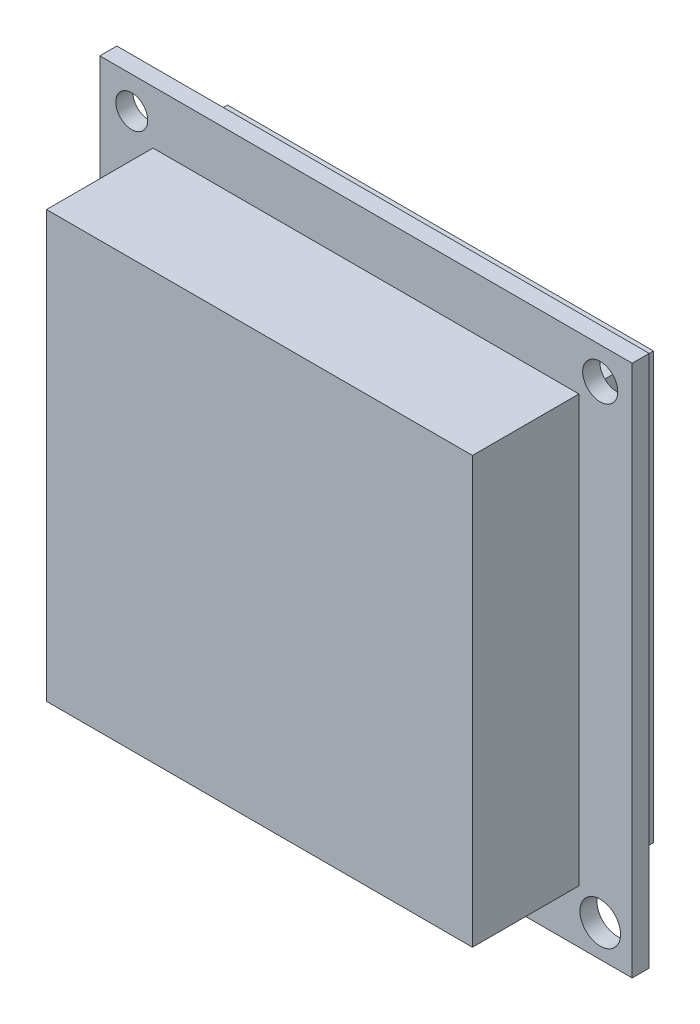
ISO-10303-21;
HEADER;
FILE_DESCRIPTION(('STEP AP214'),'2;1');
FILE_NAME('part.step','',(''),(''),'','','');
FILE_SCHEMA(('AUTOMOTIVE_DESIGN { 1 0 10303 214 1 1 1 1 }'));
ENDSEC;
DATA;
#1=APPLICATION_CONTEXT('core data for automotive mechanical design processes');
#2=APPLICATION_PROTOCOL_DEFINITION('international standard','automotive_design',2000,#1);
#3=PRODUCT_CONTEXT('',#1,'mechanical');
#4=PRODUCT('Part','Part','',(#3));
#5=PRODUCT_RELATED_PRODUCT_CATEGORY('part','',(#4));
#6=PRODUCT_DEFINITION_FORMATION('','',#4);
#7=PRODUCT_DEFINITION_CONTEXT('part definition',#1,'design');
#8=PRODUCT_DEFINITION('design','',#6,#7);
#9=PRODUCT_DEFINITION_SHAPE('','',#8);
#10=(LENGTH_UNIT() NAMED_UNIT(*) SI_UNIT(.MILLI.,.METRE.));
#11=(NAMED_UNIT(*) PLANE_ANGLE_UNIT() SI_UNIT($,.RADIAN.));
#12=(NAMED_UNIT(*) SI_UNIT($,.STERADIAN.) SOLID_ANGLE_UNIT());
#13=UNCERTAINTY_MEASURE_WITH_UNIT(LENGTH_MEASURE(1.E-05),#10,'distance_accuracy_value','');
#14=(GEOMETRIC_REPRESENTATION_CONTEXT(3) GLOBAL_UNCERTAINTY_ASSIGNED_CONTEXT((#13)) GLOBAL_UNIT_ASSIGNED_CONTEXT((#10,
#11,#12)) REPRESENTATION_CONTEXT('',''));
#15=CARTESIAN_POINT('',(0.,0.,0.));
#16=DIRECTION('',(0.,0.,1.));
#17=DIRECTION('',(1.,0.,0.));
#18=AXIS2_PLACEMENT_3D('',#15,#16,#17);
#19=CARTESIAN_POINT('',(0.,-55.1414213562373,0.8));
#20=DIRECTION('',(0.,0.,1.));
#21=DIRECTION('',(1.,0.,0.));
#22=AXIS2_PLACEMENT_3D('',#19,#20,#21);
#23=PLANE('',#22);
#24=CARTESIAN_POINT('',(-22.,-22.,0.8));
#25=DIRECTION('',(0.,0.,1.));
#26=DIRECTION('',(1.,0.,0.));
#27=AXIS2_PLACEMENT_3D('',#24,#25,#26);
#28=CIRCLE('',#27,1.75908055301192);
#29=CARTESIAN_POINT('',(-20.2409194469881,-22.,0.8));
#30=VERTEX_POINT('',#29);
#31=EDGE_CURVE('E197',#30,#30,#28,.T.);
#32=ORIENTED_EDGE('',*,*,#31,.F.);
#33=EDGE_LOOP('',(#32));
#34=FACE_BOUND('',#33,.T.);
#35=CARTESIAN_POINT('',(22.,22.,0.8));
#36=DIRECTION('',(0.,0.,1.));
#37=DIRECTION('',(1.,0.,0.));
#38=AXIS2_PLACEMENT_3D('',#35,#36,#37);
#39=CIRCLE('',#38,1.64693502393852);
#40=CARTESIAN_POINT('',(23.6469350239385,22.,0.8));
#41=VERTEX_POINT('',#40);
#42=EDGE_CURVE('E194',#41,#41,#39,.T.);
#43=ORIENTED_EDGE('',*,*,#42,.F.);
#44=EDGE_LOOP('',(#43));
#45=FACE_BOUND('',#44,.T.);
#46=CARTESIAN_POINT('',(22.,-22.,0.8));
#47=DIRECTION('',(0.,0.,1.));
#48=DIRECTION('',(1.,0.,0.));
#49=AXIS2_PLACEMENT_3D('',#46,#47,#48);
#50=CIRCLE('',#49,1.90819247149676);
#51=CARTESIAN_POINT('',(23.9081924714968,-22.,0.8));
#52=VERTEX_POINT('',#51);
#53=EDGE_CURVE('E191',#52,#52,#50,.T.);
#54=ORIENTED_EDGE('',*,*,#53,.F.);
#55=EDGE_LOOP('',(#54));
#56=FACE_BOUND('',#55,.T.);
#57=CARTESIAN_POINT('',(-22.,22.,0.8));
#58=DIRECTION('',(0.,0.,1.));
#59=DIRECTION('',(1.,0.,0.));
#60=AXIS2_PLACEMENT_3D('',#57,#58,#59);
#61=CIRCLE('',#60,1.5);
#62=CARTESIAN_POINT('',(-20.5,22.,0.8));
#63=VERTEX_POINT('',#62);
#64=EDGE_CURVE('E188',#63,#63,#61,.T.);
#65=ORIENTED_EDGE('',*,*,#64,.F.);
#66=EDGE_LOOP('',(#65));
#67=FACE_BOUND('',#66,.T.);
#68=DIRECTION('',(-1.,0.,0.));
#69=VECTOR('',#68,1.);
#70=CARTESIAN_POINT('',(0.,-25.,0.8));
#71=LINE('',#70,#69);
#72=CARTESIAN_POINT('',(25.,-25.,0.8));
#73=VERTEX_POINT('',#72);
#74=CARTESIAN_POINT('',(-25.,-25.,0.8));
#75=VERTEX_POINT('',#74);
#76=EDGE_CURVE('E175',#73,#75,#71,.T.);
#77=ORIENTED_EDGE('',*,*,#76,.F.);
#78=DIRECTION('',(0.,-1.,0.));
#79=VECTOR('',#78,1.);
#80=CARTESIAN_POINT('',(25.,-55.1414213562373,0.8));
#81=LINE('',#80,#79);
#82=CARTESIAN_POINT('',(25.,25.,0.8));
#83=VERTEX_POINT('',#82);
#84=EDGE_CURVE('E178',#83,#73,#81,.T.);
#85=ORIENTED_EDGE('',*,*,#84,.F.);
#86=DIRECTION('',(1.,0.,0.));
#87=VECTOR('',#86,1.);
#88=CARTESIAN_POINT('',(0.,25.,0.8));
#89=LINE('',#88,#87);
#90=CARTESIAN_POINT('',(-25.,25.,0.8));
#91=VERTEX_POINT('',#90);
#92=EDGE_CURVE('E182',#91,#83,#89,.T.);
#93=ORIENTED_EDGE('',*,*,#92,.F.);
#94=DIRECTION('',(0.,1.,0.));
#95=VECTOR('',#94,1.);
#96=CARTESIAN_POINT('',(-25.,-55.1414213562373,0.8));
#97=LINE('',#96,#95);
#98=EDGE_CURVE('E185',#75,#91,#97,.T.);
#99=ORIENTED_EDGE('',*,*,#98,.F.);
#100=EDGE_LOOP('',(#77,#85,#93,#99));
#101=FACE_BOUND('',#100,.T.);
#102=DIRECTION('',(0.,-1.,0.));
#103=VECTOR('',#102,1.);
#104=CARTESIAN_POINT('',(20.,-55.1414213562373,0.8));
#105=LINE('',#104,#103);
#106=CARTESIAN_POINT('',(20.,20.,0.8));
#107=VERTEX_POINT('',#106);
#108=CARTESIAN_POINT('',(20.,-20.,0.8));
#109=VERTEX_POINT('',#108);
#110=EDGE_CURVE('E156',#107,#109,#105,.T.);
#111=ORIENTED_EDGE('',*,*,#110,.T.);
#112=DIRECTION('',(-1.,0.,0.));
#113=VECTOR('',#112,1.);
#114=CARTESIAN_POINT('',(0.,-20.,0.8));
#115=LINE('',#114,#113);
#116=CARTESIAN_POINT('',(-20.,-20.,0.8));
#117=VERTEX_POINT('',#116);
#118=EDGE_CURVE('E123',#109,#117,#115,.T.);
#119=ORIENTED_EDGE('',*,*,#118,.T.);
#120=DIRECTION('',(0.,1.,0.));
#121=VECTOR('',#120,1.);
#122=CARTESIAN_POINT('',(-20.,-55.1414213562373,0.8));
#123=LINE('',#122,#121);
#124=CARTESIAN_POINT('',(-20.,20.,0.8));
#125=VERTEX_POINT('',#124);
#126=EDGE_CURVE('E170',#117,#125,#123,.T.);
#127=ORIENTED_EDGE('',*,*,#126,.T.);
#128=DIRECTION('',(1.,0.,0.));
#129=VECTOR('',#128,1.);
#130=CARTESIAN_POINT('',(0.,20.,0.8));
#131=LINE('',#130,#129);
#132=EDGE_CURVE('E167',#125,#107,#131,.T.);
#133=ORIENTED_EDGE('',*,*,#132,.T.);
#134=EDGE_LOOP('',(#111,#119,#127,#133));
#135=FACE_BOUND('',#134,.T.);
#136=ADVANCED_FACE('F31',(#34,#45,#56,#67,#101,#135),#23,.T.);
#137=CARTESIAN_POINT('',(0.,-55.1414213562373,-0.8));
#138=DIRECTION('',(0.,0.,1.));
#139=DIRECTION('',(1.,0.,0.));
#140=AXIS2_PLACEMENT_3D('',#137,#138,#139);
#141=PLANE('',#140);
#142=CARTESIAN_POINT('',(-22.,-22.,-0.8));
#143=DIRECTION('',(0.,0.,1.));
#144=DIRECTION('',(1.,0.,0.));
#145=AXIS2_PLACEMENT_3D('',#142,#143,#144);
#146=CIRCLE('',#145,1.75908055301192);
#147=CARTESIAN_POINT('',(-20.2409194469881,-22.,-0.8));
#148=VERTEX_POINT('',#147);
#149=EDGE_CURVE('E179',#148,#148,#146,.T.);
#150=ORIENTED_EDGE('',*,*,#149,.T.);
#151=EDGE_LOOP('',(#150));
#152=FACE_BOUND('',#151,.T.);
#153=CARTESIAN_POINT('',(22.,22.,-0.8));
#154=DIRECTION('',(0.,0.,1.));
#155=DIRECTION('',(1.,0.,0.));
#156=AXIS2_PLACEMENT_3D('',#153,#154,#155);
#157=CIRCLE('',#156,1.64693502393852);
#158=CARTESIAN_POINT('',(23.6469350239385,22.,-0.8));
#159=VERTEX_POINT('',#158);
#160=EDGE_CURVE('E218',#159,#159,#157,.T.);
#161=ORIENTED_EDGE('',*,*,#160,.T.);
#162=EDGE_LOOP('',(#161));
#163=FACE_BOUND('',#162,.T.);
#164=CARTESIAN_POINT('',(22.,-22.,-0.8));
#165=DIRECTION('',(0.,0.,1.));
#166=DIRECTION('',(1.,0.,0.));
#167=AXIS2_PLACEMENT_3D('',#164,#165,#166);
#168=CIRCLE('',#167,1.90819247149676);
#169=CARTESIAN_POINT('',(23.9081924714968,-22.,-0.8));
#170=VERTEX_POINT('',#169);
#171=EDGE_CURVE('E215',#170,#170,#168,.T.);
#172=ORIENTED_EDGE('',*,*,#171,.T.);
#173=EDGE_LOOP('',(#172));
#174=FACE_BOUND('',#173,.T.);
#175=CARTESIAN_POINT('',(-22.,22.,-0.8));
#176=DIRECTION('',(0.,0.,1.));
#177=DIRECTION('',(1.,0.,0.));
#178=AXIS2_PLACEMENT_3D('',#175,#176,#177);
#179=CIRCLE('',#178,1.5);
#180=CARTESIAN_POINT('',(-20.5,22.,-0.8));
#181=VERTEX_POINT('',#180);
#182=EDGE_CURVE('E212',#181,#181,#179,.T.);
#183=ORIENTED_EDGE('',*,*,#182,.T.);
#184=EDGE_LOOP('',(#183));
#185=FACE_BOUND('',#184,.T.);
#186=DIRECTION('',(-1.,0.,0.));
#187=VECTOR('',#186,1.);
#188=CARTESIAN_POINT('',(0.,-25.,-0.8));
#189=LINE('',#188,#187);
#190=CARTESIAN_POINT('',(25.,-25.,-0.8));
#191=VERTEX_POINT('',#190);
#192=CARTESIAN_POINT('',(-25.,-25.,-0.8));
#193=VERTEX_POINT('',#192);
#194=EDGE_CURVE('E174',#191,#193,#189,.T.);
#195=ORIENTED_EDGE('',*,*,#194,.T.);
#196=DIRECTION('',(0.,1.,0.));
#197=VECTOR('',#196,1.);
#198=CARTESIAN_POINT('',(-25.,-55.1414213562373,-0.8));
#199=LINE('',#198,#197);
#200=CARTESIAN_POINT('',(-25.,25.,-0.8));
#201=VERTEX_POINT('',#200);
#202=EDGE_CURVE('E209',#193,#201,#199,.T.);
#203=ORIENTED_EDGE('',*,*,#202,.T.);
#204=DIRECTION('',(1.,0.,0.));
#205=VECTOR('',#204,1.);
#206=CARTESIAN_POINT('',(0.,25.,-0.8));
#207=LINE('',#206,#205);
#208=CARTESIAN_POINT('',(25.,25.,-0.8));
#209=VERTEX_POINT('',#208);
#210=EDGE_CURVE('E206',#201,#209,#207,.T.);
#211=ORIENTED_EDGE('',*,*,#210,.T.);
#212=DIRECTION('',(0.,-1.,0.));
#213=VECTOR('',#212,1.);
#214=CARTESIAN_POINT('',(25.,-55.1414213562373,-0.8));
#215=LINE('',#214,#213);
#216=EDGE_CURVE('E203',#209,#191,#215,.T.);
#217=ORIENTED_EDGE('',*,*,#216,.T.);
#218=EDGE_LOOP('',(#195,#203,#211,#217));
#219=FACE_BOUND('',#218,.T.);
#220=DIRECTION('',(-1.,0.,0.));
#221=VECTOR('',#220,1.);
#222=CARTESIAN_POINT('',(0.,-20.,-0.8));
#223=LINE('',#222,#221);
#224=CARTESIAN_POINT('',(20.,-20.,-0.8));
#225=VERTEX_POINT('',#224);
#226=CARTESIAN_POINT('',(-20.,-20.,-0.8));
#227=VERTEX_POINT('',#226);
#228=EDGE_CURVE('E11',#225,#227,#223,.T.);
#229=ORIENTED_EDGE('',*,*,#228,.F.);
#230=DIRECTION('',(0.,-1.,0.));
#231=VECTOR('',#230,1.);
#232=CARTESIAN_POINT('',(20.,-55.1414213562373,-0.8));
#233=LINE('',#232,#231);
#234=CARTESIAN_POINT('',(20.,20.,-0.8));
#235=VERTEX_POINT('',#234);
#236=EDGE_CURVE('E230',#235,#225,#233,.T.);
#237=ORIENTED_EDGE('',*,*,#236,.F.);
#238=DIRECTION('',(1.,0.,0.));
#239=VECTOR('',#238,1.);
#240=CARTESIAN_POINT('',(0.,20.,-0.8));
#241=LINE('',#240,#239);
#242=CARTESIAN_POINT('',(-20.,20.,-0.8));
#243=VERTEX_POINT('',#242);
#244=EDGE_CURVE('E233',#243,#235,#241,.T.);
#245=ORIENTED_EDGE('',*,*,#244,.F.);
#246=DIRECTION('',(0.,1.,0.));
#247=VECTOR('',#246,1.);
#248=CARTESIAN_POINT('',(-20.,-55.1414213562373,-0.8));
#249=LINE('',#248,#247);
#250=EDGE_CURVE('E39',#227,#243,#249,.T.);
#251=ORIENTED_EDGE('',*,*,#250,.F.);
#252=EDGE_LOOP('',(#229,#237,#245,#251));
#253=FACE_BOUND('',#252,.T.);
#254=ADVANCED_FACE('F250',(#152,#163,#174,#185,#219,#253),#141,.F.);
#255=CARTESIAN_POINT('',(0.,-25.,0.8));
#256=DIRECTION('',(0.,-1.,0.));
#257=DIRECTION('',(1.,0.,0.));
#258=AXIS2_PLACEMENT_3D('',#255,#256,#257);
#259=PLANE('',#258);
#260=ORIENTED_EDGE('',*,*,#194,.F.);
#261=DIRECTION('',(0.,0.,-1.));
#262=VECTOR('',#261,1.);
#263=CARTESIAN_POINT('',(25.,-25.,0.8));
#264=LINE('',#263,#262);
#265=EDGE_CURVE('E228',#73,#191,#264,.T.);
#266=ORIENTED_EDGE('',*,*,#265,.F.);
#267=ORIENTED_EDGE('',*,*,#76,.T.);
#268=DIRECTION('',(0.,0.,-1.));
#269=VECTOR('',#268,1.);
#270=CARTESIAN_POINT('',(-25.,-25.,0.8));
#271=LINE('',#270,#269);
#272=EDGE_CURVE('E200',#75,#193,#271,.T.);
#273=ORIENTED_EDGE('',*,*,#272,.T.);
#274=EDGE_LOOP('',(#260,#266,#267,#273));
#275=FACE_BOUND('',#274,.T.);
#276=ADVANCED_FACE('F33',(#275),#259,.T.);
#277=CARTESIAN_POINT('',(25.,-55.1414213562373,0.8));
#278=DIRECTION('',(1.,0.,0.));
#279=DIRECTION('',(0.,1.,0.));
#280=AXIS2_PLACEMENT_3D('',#277,#278,#279);
#281=PLANE('',#280);
#282=ORIENTED_EDGE('',*,*,#216,.F.);
#283=DIRECTION('',(0.,0.,-1.));
#284=VECTOR('',#283,1.);
#285=CARTESIAN_POINT('',(25.,25.,0.8));
#286=LINE('',#285,#284);
#287=EDGE_CURVE('E226',#83,#209,#286,.T.);
#288=ORIENTED_EDGE('',*,*,#287,.F.);
#289=ORIENTED_EDGE('',*,*,#84,.T.);
#290=ORIENTED_EDGE('',*,*,#265,.T.);
#291=EDGE_LOOP('',(#282,#288,#289,#290));
#292=FACE_BOUND('',#291,.T.);
#293=ADVANCED_FACE('F297',(#292),#281,.T.);
#294=CARTESIAN_POINT('',(0.,25.,0.8));
#295=DIRECTION('',(0.,1.,0.));
#296=DIRECTION('',(0.,0.,1.));
#297=AXIS2_PLACEMENT_3D('',#294,#295,#296);
#298=PLANE('',#297);
#299=ORIENTED_EDGE('',*,*,#210,.F.);
#300=DIRECTION('',(0.,0.,-1.));
#301=VECTOR('',#300,1.);
#302=CARTESIAN_POINT('',(-25.,25.,0.8));
#303=LINE('',#302,#301);
#304=EDGE_CURVE('E224',#91,#201,#303,.T.);
#305=ORIENTED_EDGE('',*,*,#304,.F.);
#306=ORIENTED_EDGE('',*,*,#92,.T.);
#307=ORIENTED_EDGE('',*,*,#287,.T.);
#308=EDGE_LOOP('',(#299,#305,#306,#307));
#309=FACE_BOUND('',#308,.T.);
#310=ADVANCED_FACE('F284',(#309),#298,.T.);
#311=CARTESIAN_POINT('',(22.,22.,0.8));
#312=DIRECTION('',(0.,0.,-1.));
#313=DIRECTION('',(-1.,0.,0.));
#314=AXIS2_PLACEMENT_3D('',#311,#312,#313);
#315=CYLINDRICAL_SURFACE('',#314,1.64693502393852);
#316=ORIENTED_EDGE('',*,*,#42,.T.);
#317=EDGE_LOOP('',(#316));
#318=FACE_BOUND('',#317,.T.);
#319=ORIENTED_EDGE('',*,*,#160,.F.);
#320=EDGE_LOOP('',(#319));
#321=FACE_BOUND('',#320,.T.);
#322=ADVANCED_FACE('F280',(#318,#321),#315,.F.);
#323=CARTESIAN_POINT('',(22.,-22.,0.8));
#324=DIRECTION('',(0.,0.,-1.));
#325=DIRECTION('',(-1.,0.,0.));
#326=AXIS2_PLACEMENT_3D('',#323,#324,#325);
#327=CYLINDRICAL_SURFACE('',#326,1.90819247149676);
#328=ORIENTED_EDGE('',*,*,#53,.T.);
#329=EDGE_LOOP('',(#328));
#330=FACE_BOUND('',#329,.T.);
#331=ORIENTED_EDGE('',*,*,#171,.F.);
#332=EDGE_LOOP('',(#331));
#333=FACE_BOUND('',#332,.T.);
#334=ADVANCED_FACE('F283',(#330,#333),#327,.F.);
#335=CARTESIAN_POINT('',(-22.,22.,0.8));
#336=DIRECTION('',(0.,0.,-1.));
#337=DIRECTION('',(-1.,0.,0.));
#338=AXIS2_PLACEMENT_3D('',#335,#336,#337);
#339=CYLINDRICAL_SURFACE('',#338,1.5);
#340=ORIENTED_EDGE('',*,*,#64,.T.);
#341=EDGE_LOOP('',(#340));
#342=FACE_BOUND('',#341,.T.);
#343=ORIENTED_EDGE('',*,*,#182,.F.);
#344=EDGE_LOOP('',(#343));
#345=FACE_BOUND('',#344,.T.);
#346=ADVANCED_FACE('F288',(#342,#345),#339,.F.);
#347=CARTESIAN_POINT('',(-25.,-55.1414213562373,0.8));
#348=DIRECTION('',(-1.,0.,0.));
#349=DIRECTION('',(0.,0.,1.));
#350=AXIS2_PLACEMENT_3D('',#347,#348,#349);
#351=PLANE('',#350);
#352=ORIENTED_EDGE('',*,*,#202,.F.);
#353=ORIENTED_EDGE('',*,*,#272,.F.);
#354=ORIENTED_EDGE('',*,*,#98,.T.);
#355=ORIENTED_EDGE('',*,*,#304,.T.);
#356=EDGE_LOOP('',(#352,#353,#354,#355));
#357=FACE_BOUND('',#356,.T.);
#358=ADVANCED_FACE('F278',(#357),#351,.T.);
#359=CARTESIAN_POINT('',(-22.,-22.,0.8));
#360=DIRECTION('',(0.,0.,-1.));
#361=DIRECTION('',(-1.,0.,0.));
#362=AXIS2_PLACEMENT_3D('',#359,#360,#361);
#363=CYLINDRICAL_SURFACE('',#362,1.75908055301192);
#364=ORIENTED_EDGE('',*,*,#31,.T.);
#365=EDGE_LOOP('',(#364));
#366=FACE_BOUND('',#365,.T.);
#367=ORIENTED_EDGE('',*,*,#149,.F.);
#368=EDGE_LOOP('',(#367));
#369=FACE_BOUND('',#368,.T.);
#370=ADVANCED_FACE('F261',(#366,#369),#363,.F.);
#371=CARTESIAN_POINT('',(0.,-55.1414213562373,-6.2));
#372=DIRECTION('',(0.,0.,1.));
#373=DIRECTION('',(1.,0.,0.));
#374=AXIS2_PLACEMENT_3D('',#371,#372,#373);
#375=PLANE('',#374);
#376=DIRECTION('',(-1.,0.,0.));
#377=VECTOR('',#376,1.);
#378=CARTESIAN_POINT('',(0.,-20.,-6.2));
#379=LINE('',#378,#377);
#380=CARTESIAN_POINT('',(20.,-20.,-6.2));
#381=VERTEX_POINT('',#380);
#382=CARTESIAN_POINT('',(-20.,-20.,-6.2));
#383=VERTEX_POINT('',#382);
#384=EDGE_CURVE('E145',#381,#383,#379,.T.);
#385=ORIENTED_EDGE('',*,*,#384,.T.);
#386=DIRECTION('',(0.,1.,0.));
#387=VECTOR('',#386,1.);
#388=CARTESIAN_POINT('',(-20.,-55.1414213562373,-6.2));
#389=LINE('',#388,#387);
#390=CARTESIAN_POINT('',(-20.,20.,-6.2));
#391=VERTEX_POINT('',#390);
#392=EDGE_CURVE('E126',#383,#391,#389,.T.);
#393=ORIENTED_EDGE('',*,*,#392,.T.);
#394=DIRECTION('',(1.,0.,0.));
#395=VECTOR('',#394,1.);
#396=CARTESIAN_POINT('',(0.,20.,-6.2));
#397=LINE('',#396,#395);
#398=CARTESIAN_POINT('',(20.,20.,-6.2));
#399=VERTEX_POINT('',#398);
#400=EDGE_CURVE('E150',#391,#399,#397,.T.);
#401=ORIENTED_EDGE('',*,*,#400,.T.);
#402=DIRECTION('',(0.,-1.,0.));
#403=VECTOR('',#402,1.);
#404=CARTESIAN_POINT('',(20.,-55.1414213562373,-6.2));
#405=LINE('',#404,#403);
#406=EDGE_CURVE('E148',#399,#381,#405,.T.);
#407=ORIENTED_EDGE('',*,*,#406,.T.);
#408=EDGE_LOOP('',(#385,#393,#401,#407));
#409=FACE_BOUND('',#408,.T.);
#410=ADVANCED_FACE('F245',(#409),#375,.F.);
#411=CARTESIAN_POINT('',(20.,-55.1414213562373,-6.2));
#412=DIRECTION('',(-1.,0.,0.));
#413=DIRECTION('',(0.,-1.,0.));
#414=AXIS2_PLACEMENT_3D('',#411,#412,#413);
#415=PLANE('',#414);
#416=DIRECTION('',(0.,0.,1.));
#417=VECTOR('',#416,1.);
#418=CARTESIAN_POINT('',(20.,20.,-6.2));
#419=LINE('',#418,#417);
#420=EDGE_CURVE('E162',#399,#235,#419,.T.);
#421=ORIENTED_EDGE('',*,*,#420,.T.);
#422=ORIENTED_EDGE('',*,*,#236,.T.);
#423=DIRECTION('',(0.,0.,1.));
#424=VECTOR('',#423,1.);
#425=CARTESIAN_POINT('',(20.,-20.,-6.2));
#426=LINE('',#425,#424);
#427=EDGE_CURVE('E125',#381,#225,#426,.T.);
#428=ORIENTED_EDGE('',*,*,#427,.F.);
#429=ORIENTED_EDGE('',*,*,#406,.F.);
#430=EDGE_LOOP('',(#421,#422,#428,#429));
#431=FACE_BOUND('',#430,.T.);
#432=ADVANCED_FACE('F252',(#431),#415,.F.);
#433=CARTESIAN_POINT('',(0.,20.,-6.2));
#434=DIRECTION('',(0.,-1.,0.));
#435=DIRECTION('',(0.,0.,-1.));
#436=AXIS2_PLACEMENT_3D('',#433,#434,#435);
#437=PLANE('',#436);
#438=DIRECTION('',(0.,0.,1.));
#439=VECTOR('',#438,1.);
#440=CARTESIAN_POINT('',(-20.,20.,-6.2));
#441=LINE('',#440,#439);
#442=EDGE_CURVE('E158',#391,#243,#441,.T.);
#443=ORIENTED_EDGE('',*,*,#442,.T.);
#444=ORIENTED_EDGE('',*,*,#244,.T.);
#445=ORIENTED_EDGE('',*,*,#420,.F.);
#446=ORIENTED_EDGE('',*,*,#400,.F.);
#447=EDGE_LOOP('',(#443,#444,#445,#446));
#448=FACE_BOUND('',#447,.T.);
#449=ADVANCED_FACE('F241',(#448),#437,.F.);
#450=CARTESIAN_POINT('',(-20.,-55.1414213562373,-6.2));
#451=DIRECTION('',(1.,0.,0.));
#452=DIRECTION('',(0.,0.,-1.));
#453=AXIS2_PLACEMENT_3D('',#450,#451,#452);
#454=PLANE('',#453);
#455=DIRECTION('',(0.,0.,1.));
#456=VECTOR('',#455,1.);
#457=CARTESIAN_POINT('',(-20.,-20.,-6.2));
#458=LINE('',#457,#456);
#459=EDGE_CURVE('E153',#383,#227,#458,.T.);
#460=ORIENTED_EDGE('',*,*,#459,.T.);
#461=ORIENTED_EDGE('',*,*,#250,.T.);
#462=ORIENTED_EDGE('',*,*,#442,.F.);
#463=ORIENTED_EDGE('',*,*,#392,.F.);
#464=EDGE_LOOP('',(#460,#461,#462,#463));
#465=FACE_BOUND('',#464,.T.);
#466=ADVANCED_FACE('F237',(#465),#454,.F.);
#467=CARTESIAN_POINT('',(0.,-20.,-6.2));
#468=DIRECTION('',(0.,1.,0.));
#469=DIRECTION('',(-1.,0.,0.));
#470=AXIS2_PLACEMENT_3D('',#467,#468,#469);
#471=PLANE('',#470);
#472=ORIENTED_EDGE('',*,*,#427,.T.);
#473=ORIENTED_EDGE('',*,*,#228,.T.);
#474=ORIENTED_EDGE('',*,*,#459,.F.);
#475=ORIENTED_EDGE('',*,*,#384,.F.);
#476=EDGE_LOOP('',(#472,#473,#474,#475));
#477=FACE_BOUND('',#476,.T.);
#478=ADVANCED_FACE('F249',(#477),#471,.F.);
#479=ORIENTED_EDGE('',*,*,#118,.F.);
#480=CARTESIAN_POINT('',(20.,-20.,10.8));
#481=VERTEX_POINT('',#480);
#482=EDGE_CURVE('E46',#109,#481,#426,.T.);
#483=ORIENTED_EDGE('',*,*,#482,.T.);
#484=DIRECTION('',(-1.,0.,0.));
#485=VECTOR('',#484,1.);
#486=CARTESIAN_POINT('',(0.,-20.,10.8));
#487=LINE('',#486,#485);
#488=CARTESIAN_POINT('',(-20.,-20.,10.8));
#489=VERTEX_POINT('',#488);
#490=EDGE_CURVE('E120',#481,#489,#487,.T.);
#491=ORIENTED_EDGE('',*,*,#490,.T.);
#492=EDGE_CURVE('E157',#117,#489,#458,.T.);
#493=ORIENTED_EDGE('',*,*,#492,.F.);
#494=EDGE_LOOP('',(#479,#483,#491,#493));
#495=FACE_BOUND('',#494,.T.);
#496=ADVANCED_FACE('F118',(#495),#471,.F.);
#497=ORIENTED_EDGE('',*,*,#126,.F.);
#498=ORIENTED_EDGE('',*,*,#492,.T.);
#499=DIRECTION('',(0.,1.,0.));
#500=VECTOR('',#499,1.);
#501=CARTESIAN_POINT('',(-20.,-55.1414213562373,10.8));
#502=LINE('',#501,#500);
#503=CARTESIAN_POINT('',(-20.,20.,10.8));
#504=VERTEX_POINT('',#503);
#505=EDGE_CURVE('E135',#489,#504,#502,.T.);
#506=ORIENTED_EDGE('',*,*,#505,.T.);
#507=EDGE_CURVE('E161',#125,#504,#441,.T.);
#508=ORIENTED_EDGE('',*,*,#507,.F.);
#509=EDGE_LOOP('',(#497,#498,#506,#508));
#510=FACE_BOUND('',#509,.T.);
#511=ADVANCED_FACE('F319',(#510),#454,.F.);
#512=ORIENTED_EDGE('',*,*,#132,.F.);
#513=ORIENTED_EDGE('',*,*,#507,.T.);
#514=DIRECTION('',(1.,0.,0.));
#515=VECTOR('',#514,1.);
#516=CARTESIAN_POINT('',(0.,20.,10.8));
#517=LINE('',#516,#515);
#518=CARTESIAN_POINT('',(20.,20.,10.8));
#519=VERTEX_POINT('',#518);
#520=EDGE_CURVE('E140',#504,#519,#517,.T.);
#521=ORIENTED_EDGE('',*,*,#520,.T.);
#522=EDGE_CURVE('E139',#107,#519,#419,.T.);
#523=ORIENTED_EDGE('',*,*,#522,.F.);
#524=EDGE_LOOP('',(#512,#513,#521,#523));
#525=FACE_BOUND('',#524,.T.);
#526=ADVANCED_FACE('F260',(#525),#437,.F.);
#527=ORIENTED_EDGE('',*,*,#110,.F.);
#528=ORIENTED_EDGE('',*,*,#522,.T.);
#529=DIRECTION('',(0.,-1.,0.));
#530=VECTOR('',#529,1.);
#531=CARTESIAN_POINT('',(20.,-55.1414213562373,10.8));
#532=LINE('',#531,#530);
#533=EDGE_CURVE('E132',#519,#481,#532,.T.);
#534=ORIENTED_EDGE('',*,*,#533,.T.);
#535=ORIENTED_EDGE('',*,*,#482,.F.);
#536=EDGE_LOOP('',(#527,#528,#534,#535));
#537=FACE_BOUND('',#536,.T.);
#538=ADVANCED_FACE('F137',(#537),#415,.F.);
#539=CARTESIAN_POINT('',(0.,-55.1414213562373,10.8));
#540=DIRECTION('',(0.,0.,1.));
#541=DIRECTION('',(1.,0.,0.));
#542=AXIS2_PLACEMENT_3D('',#539,#540,#541);
#543=PLANE('',#542);
#544=ORIENTED_EDGE('',*,*,#490,.F.);
#545=ORIENTED_EDGE('',*,*,#533,.F.);
#546=ORIENTED_EDGE('',*,*,#520,.F.);
#547=ORIENTED_EDGE('',*,*,#505,.F.);
#548=EDGE_LOOP('',(#544,#545,#546,#547));
#549=FACE_BOUND('',#548,.T.);
#550=ADVANCED_FACE('F130',(#549),#543,.T.);
#551=CLOSED_SHELL('',(#136,#254,#276,#293,#310,#322,#334,#346,#358,#370,#410,#432,#449,#466,
#478,#496,#511,#526,#538,#550));
#552=MANIFOLD_SOLID_BREP('B2',#551);
#553=ADVANCED_BREP_SHAPE_REPRESENTATION('',(#18,#552),#14);
#554=SHAPE_DEFINITION_REPRESENTATION(#9,#553);
ENDSEC;
END-ISO-10303-21;
